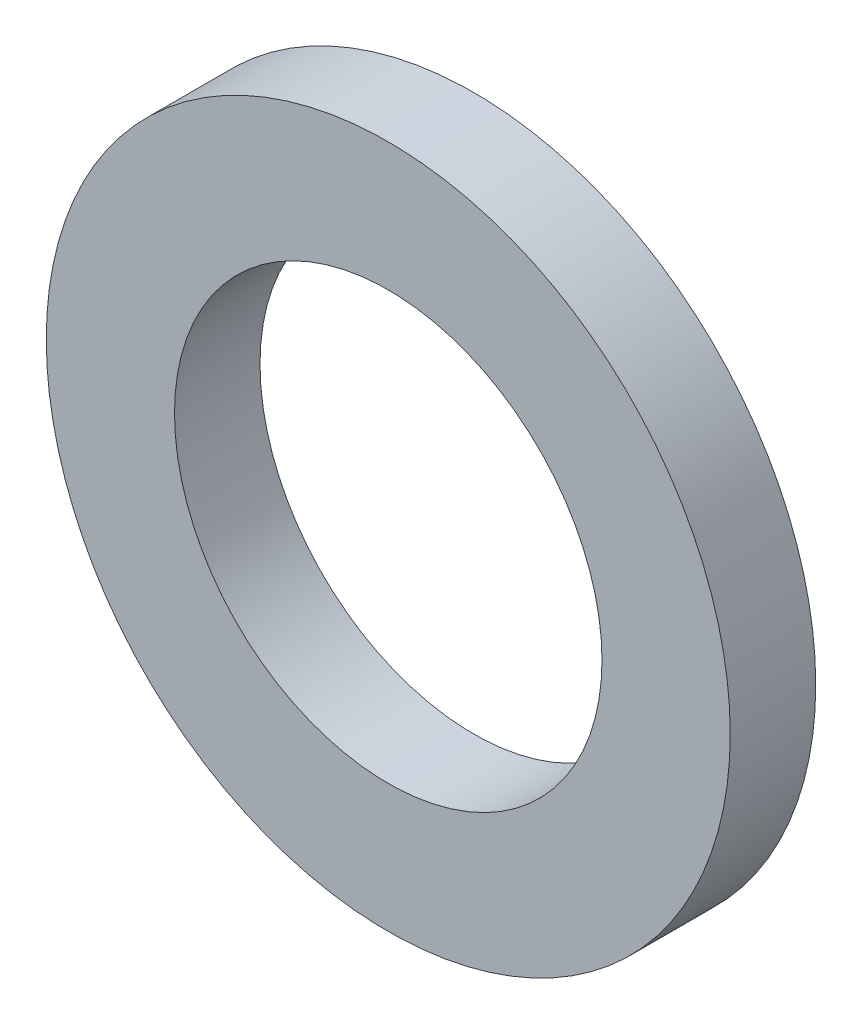
ISO-10303-21;
HEADER;
FILE_DESCRIPTION(('STEP AP214'),'2;1');
FILE_NAME('part.step','',(''),(''),'','','');
FILE_SCHEMA(('AUTOMOTIVE_DESIGN { 1 0 10303 214 1 1 1 1 }'));
ENDSEC;
DATA;
#1=APPLICATION_CONTEXT('core data for automotive mechanical design processes');
#2=APPLICATION_PROTOCOL_DEFINITION('international standard','automotive_design',2000,#1);
#3=PRODUCT_CONTEXT('',#1,'mechanical');
#4=PRODUCT('Part','Part','',(#3));
#5=PRODUCT_RELATED_PRODUCT_CATEGORY('part','',(#4));
#6=PRODUCT_DEFINITION_FORMATION('','',#4);
#7=PRODUCT_DEFINITION_CONTEXT('part definition',#1,'design');
#8=PRODUCT_DEFINITION('design','',#6,#7);
#9=PRODUCT_DEFINITION_SHAPE('','',#8);
#10=(LENGTH_UNIT() NAMED_UNIT(*) SI_UNIT(.MILLI.,.METRE.));
#11=(NAMED_UNIT(*) PLANE_ANGLE_UNIT() SI_UNIT($,.RADIAN.));
#12=(NAMED_UNIT(*) SI_UNIT($,.STERADIAN.) SOLID_ANGLE_UNIT());
#13=UNCERTAINTY_MEASURE_WITH_UNIT(LENGTH_MEASURE(1.E-05),#10,'distance_accuracy_value','');
#14=(GEOMETRIC_REPRESENTATION_CONTEXT(3) GLOBAL_UNCERTAINTY_ASSIGNED_CONTEXT((#13)) GLOBAL_UNIT_ASSIGNED_CONTEXT((#10,
#11,#12)) REPRESENTATION_CONTEXT('',''));
#15=CARTESIAN_POINT('',(0.,0.,0.));
#16=DIRECTION('',(0.,0.,1.));
#17=DIRECTION('',(1.,0.,0.));
#18=AXIS2_PLACEMENT_3D('',#15,#16,#17);
#19=CARTESIAN_POINT('',(0.,0.,3.175));
#20=DIRECTION('',(0.,0.,1.));
#21=DIRECTION('',(1.,0.,0.));
#22=AXIS2_PLACEMENT_3D('',#19,#20,#21);
#23=PLANE('',#22);
#24=CARTESIAN_POINT('',(0.,0.,3.175));
#25=DIRECTION('',(0.,0.,1.));
#26=DIRECTION('',(1.,0.,0.));
#27=AXIS2_PLACEMENT_3D('',#24,#25,#26);
#28=CIRCLE('',#27,12.7);
#29=CARTESIAN_POINT('',(12.7,0.,3.175));
#30=VERTEX_POINT('',#29);
#31=EDGE_CURVE('E10',#30,#30,#28,.T.);
#32=ORIENTED_EDGE('',*,*,#31,.T.);
#33=EDGE_LOOP('',(#32));
#34=FACE_BOUND('',#33,.T.);
#35=CARTESIAN_POINT('',(0.,0.,3.175));
#36=DIRECTION('',(0.,0.,1.));
#37=DIRECTION('',(1.,0.,0.));
#38=AXIS2_PLACEMENT_3D('',#35,#36,#37);
#39=CIRCLE('',#38,7.9375);
#40=CARTESIAN_POINT('',(7.9375,0.,3.175));
#41=VERTEX_POINT('',#40);
#42=EDGE_CURVE('E44',#41,#41,#39,.T.);
#43=ORIENTED_EDGE('',*,*,#42,.F.);
#44=EDGE_LOOP('',(#43));
#45=FACE_BOUND('',#44,.T.);
#46=ADVANCED_FACE('F33',(#34,#45),#23,.T.);
#47=CARTESIAN_POINT('',(0.,0.,0.));
#48=DIRECTION('',(0.,0.,1.));
#49=DIRECTION('',(1.,0.,0.));
#50=AXIS2_PLACEMENT_3D('',#47,#48,#49);
#51=PLANE('',#50);
#52=CARTESIAN_POINT('',(0.,0.,0.));
#53=DIRECTION('',(0.,0.,1.));
#54=DIRECTION('',(1.,0.,0.));
#55=AXIS2_PLACEMENT_3D('',#52,#53,#54);
#56=CIRCLE('',#55,12.7);
#57=CARTESIAN_POINT('',(12.7,0.,0.));
#58=VERTEX_POINT('',#57);
#59=EDGE_CURVE('E37',#58,#58,#56,.T.);
#60=ORIENTED_EDGE('',*,*,#59,.F.);
#61=EDGE_LOOP('',(#60));
#62=FACE_BOUND('',#61,.T.);
#63=CARTESIAN_POINT('',(0.,0.,0.));
#64=DIRECTION('',(0.,0.,1.));
#65=DIRECTION('',(1.,0.,0.));
#66=AXIS2_PLACEMENT_3D('',#63,#64,#65);
#67=CIRCLE('',#66,7.9375);
#68=CARTESIAN_POINT('',(7.9375,0.,0.));
#69=VERTEX_POINT('',#68);
#70=EDGE_CURVE('E46',#69,#69,#67,.T.);
#71=ORIENTED_EDGE('',*,*,#70,.T.);
#72=EDGE_LOOP('',(#71));
#73=FACE_BOUND('',#72,.T.);
#74=ADVANCED_FACE('F56',(#62,#73),#51,.F.);
#75=CARTESIAN_POINT('',(0.,0.,3.175));
#76=DIRECTION('',(0.,0.,-1.));
#77=DIRECTION('',(-1.,0.,0.));
#78=AXIS2_PLACEMENT_3D('',#75,#76,#77);
#79=CYLINDRICAL_SURFACE('',#78,12.7);
#80=ORIENTED_EDGE('',*,*,#31,.F.);
#81=EDGE_LOOP('',(#80));
#82=FACE_BOUND('',#81,.T.);
#83=ORIENTED_EDGE('',*,*,#59,.T.);
#84=EDGE_LOOP('',(#83));
#85=FACE_BOUND('',#84,.T.);
#86=ADVANCED_FACE('F35',(#82,#85),#79,.T.);
#87=CARTESIAN_POINT('',(0.,0.,3.175));
#88=DIRECTION('',(0.,0.,-1.));
#89=DIRECTION('',(-1.,0.,0.));
#90=AXIS2_PLACEMENT_3D('',#87,#88,#89);
#91=CYLINDRICAL_SURFACE('',#90,7.9375);
#92=ORIENTED_EDGE('',*,*,#42,.T.);
#93=EDGE_LOOP('',(#92));
#94=FACE_BOUND('',#93,.T.);
#95=ORIENTED_EDGE('',*,*,#70,.F.);
#96=EDGE_LOOP('',(#95));
#97=FACE_BOUND('',#96,.T.);
#98=ADVANCED_FACE('F52',(#94,#97),#91,.F.);
#99=CLOSED_SHELL('',(#46,#74,#86,#98));
#100=MANIFOLD_SOLID_BREP('B2',#99);
#101=ADVANCED_BREP_SHAPE_REPRESENTATION('',(#18,#100),#14);
#102=SHAPE_DEFINITION_REPRESENTATION(#9,#101);
ENDSEC;
END-ISO-10303-21;
